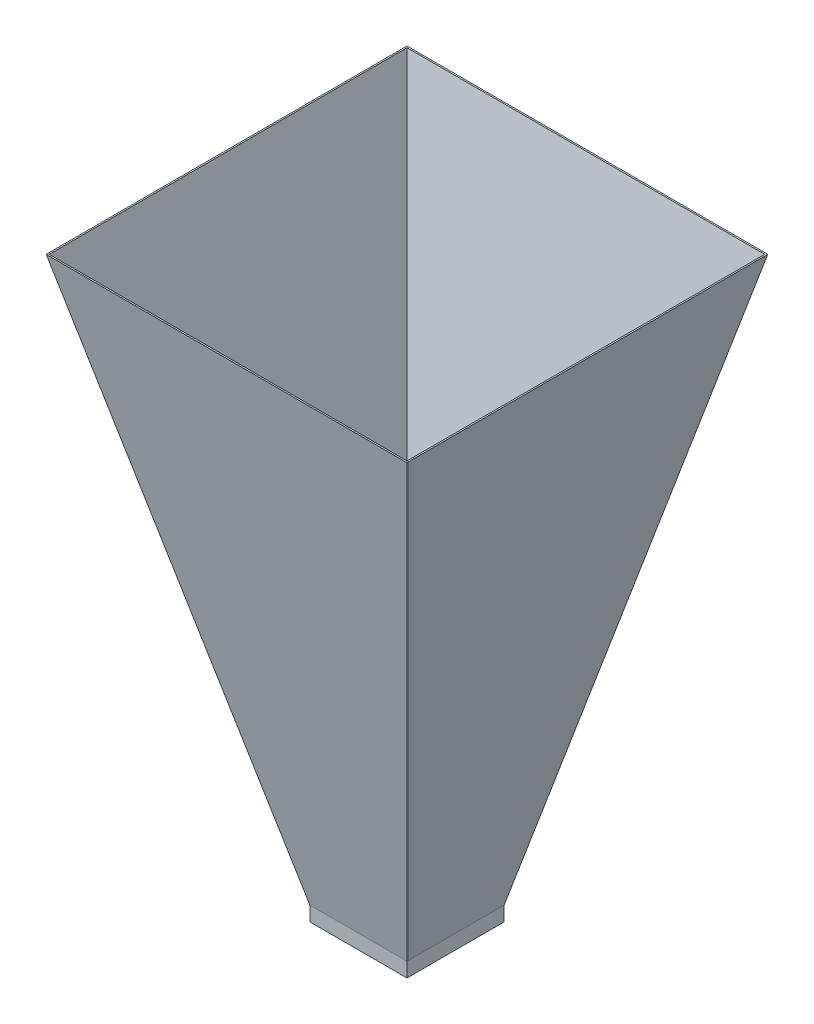
ISO-10303-21;
HEADER;
FILE_DESCRIPTION(('STEP AP214'),'2;1');
FILE_NAME('part.step','',(''),(''),'','','');
FILE_SCHEMA(('AUTOMOTIVE_DESIGN { 1 0 10303 214 1 1 1 1 }'));
ENDSEC;
DATA;
#1=APPLICATION_CONTEXT('core data for automotive mechanical design processes');
#2=APPLICATION_PROTOCOL_DEFINITION('international standard','automotive_design',2000,#1);
#3=PRODUCT_CONTEXT('',#1,'mechanical');
#4=PRODUCT('Part','Part','',(#3));
#5=PRODUCT_RELATED_PRODUCT_CATEGORY('part','',(#4));
#6=PRODUCT_DEFINITION_FORMATION('','',#4);
#7=PRODUCT_DEFINITION_CONTEXT('part definition',#1,'design');
#8=PRODUCT_DEFINITION('design','',#6,#7);
#9=PRODUCT_DEFINITION_SHAPE('','',#8);
#10=(LENGTH_UNIT() NAMED_UNIT(*) SI_UNIT(.MILLI.,.METRE.));
#11=(NAMED_UNIT(*) PLANE_ANGLE_UNIT() SI_UNIT($,.RADIAN.));
#12=(NAMED_UNIT(*) SI_UNIT($,.STERADIAN.) SOLID_ANGLE_UNIT());
#13=UNCERTAINTY_MEASURE_WITH_UNIT(LENGTH_MEASURE(1.E-05),#10,'distance_accuracy_value','');
#14=(GEOMETRIC_REPRESENTATION_CONTEXT(3) GLOBAL_UNCERTAINTY_ASSIGNED_CONTEXT((#13)) GLOBAL_UNIT_ASSIGNED_CONTEXT((#10,
#11,#12)) REPRESENTATION_CONTEXT('',''));
#15=CARTESIAN_POINT('',(0.,0.,0.));
#16=DIRECTION('',(0.,0.,1.));
#17=DIRECTION('',(1.,0.,0.));
#18=AXIS2_PLACEMENT_3D('',#15,#16,#17);
#19=CARTESIAN_POINT('',(0.,-6.16465834193122,26.3522208242994));
#20=DIRECTION('',(0.,0.227783482106071,-0.973711808123755));
#21=DIRECTION('',(0.,0.973711808123755,0.227783482106071));
#22=AXIS2_PLACEMENT_3D('',#19,#20,#21);
#23=PLANE('',#22);
#24=DIRECTION('',(0.,-0.973711808123755,-0.227783482106071));
#25=VECTOR('',#24,1.);
#26=CARTESIAN_POINT('',(32.5,-4.11365960757952,26.8320174433894));
#27=LINE('',#26,#25);
#28=CARTESIAN_POINT('',(32.5,20.1154086838659,32.5));
#29=VERTEX_POINT('',#28);
#30=CARTESIAN_POINT('',(32.5,20.,32.4730020816663));
#31=VERTEX_POINT('',#30);
#32=EDGE_CURVE('E133',#29,#31,#27,.T.);
#33=ORIENTED_EDGE('',*,*,#32,.F.);
#34=DIRECTION('',(1.,0.,0.));
#35=VECTOR('',#34,1.);
#36=CARTESIAN_POINT('',(33.5,20.1154086838659,32.5));
#37=LINE('',#36,#35);
#38=CARTESIAN_POINT('',(-32.5,20.1154086838659,32.5));
#39=VERTEX_POINT('',#38);
#40=EDGE_CURVE('E123',#39,#29,#37,.T.);
#41=ORIENTED_EDGE('',*,*,#40,.F.);
#42=DIRECTION('',(0.,0.973711808123755,0.227783482106071));
#43=VECTOR('',#42,1.);
#44=CARTESIAN_POINT('',(-32.5,10.7466366293097,30.308333529654));
#45=LINE('',#44,#43);
#46=CARTESIAN_POINT('',(-32.5,20.,32.4730020816663));
#47=VERTEX_POINT('',#46);
#48=EDGE_CURVE('E77',#47,#39,#45,.T.);
#49=ORIENTED_EDGE('',*,*,#48,.F.);
#50=DIRECTION('',(-1.,0.,0.));
#51=VECTOR('',#50,1.);
#52=CARTESIAN_POINT('',(0.,20.,32.4730020816663));
#53=LINE('',#52,#51);
#54=CARTESIAN_POINT('',(-33.5,20.,32.4730020816663));
#55=VERTEX_POINT('',#54);
#56=EDGE_CURVE('E145',#47,#55,#53,.T.);
#57=ORIENTED_EDGE('',*,*,#56,.T.);
#58=DIRECTION('',(-0.222094616583597,0.949393470890321,0.222094616583597));
#59=VECTOR('',#58,1.);
#60=CARTESIAN_POINT('',(-26.0287108865205,-11.9377084081706,25.0017129681868));
#61=LINE('',#60,#59);
#62=CARTESIAN_POINT('',(-124.5,409.,123.473002081666));
#63=VERTEX_POINT('',#62);
#64=EDGE_CURVE('E352',#55,#63,#61,.T.);
#65=ORIENTED_EDGE('',*,*,#64,.T.);
#66=DIRECTION('',(1.,0.,0.));
#67=VECTOR('',#66,1.);
#68=CARTESIAN_POINT('',(0.,409.,123.473002081666));
#69=LINE('',#68,#67);
#70=CARTESIAN_POINT('',(124.5,409.,123.473002081666));
#71=VERTEX_POINT('',#70);
#72=EDGE_CURVE('E129',#63,#71,#69,.T.);
#73=ORIENTED_EDGE('',*,*,#72,.T.);
#74=DIRECTION('',(-0.222094616583597,-0.949393470890321,-0.222094616583597));
#75=VECTOR('',#74,1.);
#76=CARTESIAN_POINT('',(26.0287108865205,-11.9377084081706,25.0017129681868));
#77=LINE('',#76,#75);
#78=CARTESIAN_POINT('',(33.5,20.,32.4730020816664));
#79=VERTEX_POINT('',#78);
#80=EDGE_CURVE('E349',#71,#79,#77,.T.);
#81=ORIENTED_EDGE('',*,*,#80,.T.);
#82=EDGE_CURVE('E141',#79,#31,#53,.T.);
#83=ORIENTED_EDGE('',*,*,#82,.T.);
#84=EDGE_LOOP('',(#33,#41,#49,#57,#65,#73,#81,#83));
#85=FACE_BOUND('',#84,.T.);
#86=ADVANCED_FACE('F59',(#85),#23,.T.);
#87=CARTESIAN_POINT('',(32.5,10.,-33.5));
#88=DIRECTION('',(-1.,0.,0.));
#89=DIRECTION('',(0.,0.,1.));
#90=AXIS2_PLACEMENT_3D('',#87,#88,#89);
#91=PLANE('',#90);
#92=DIRECTION('',(0.,1.,0.));
#93=VECTOR('',#92,1.);
#94=CARTESIAN_POINT('',(32.5,10.,32.5));
#95=LINE('',#94,#93);
#96=CARTESIAN_POINT('',(32.5,20.,32.5));
#97=VERTEX_POINT('',#96);
#98=EDGE_CURVE('E69',#97,#29,#95,.T.);
#99=ORIENTED_EDGE('',*,*,#98,.T.);
#100=ORIENTED_EDGE('',*,*,#32,.T.);
#101=DIRECTION('',(0.,0.,-1.));
#102=VECTOR('',#101,1.);
#103=CARTESIAN_POINT('',(32.5,20.,-33.5));
#104=LINE('',#103,#102);
#105=EDGE_CURVE('E136',#97,#31,#104,.T.);
#106=ORIENTED_EDGE('',*,*,#105,.F.);
#107=EDGE_LOOP('',(#99,#100,#106));
#108=FACE_BOUND('',#107,.T.);
#109=ADVANCED_FACE('F132',(#108),#91,.T.);
#110=CARTESIAN_POINT('',(33.5,10.,32.5));
#111=DIRECTION('',(0.,0.,-1.));
#112=DIRECTION('',(-1.,0.,0.));
#113=AXIS2_PLACEMENT_3D('',#110,#111,#112);
#114=PLANE('',#113);
#115=DIRECTION('',(1.,0.,0.));
#116=VECTOR('',#115,1.);
#117=CARTESIAN_POINT('',(33.5,20.,32.5));
#118=LINE('',#117,#116);
#119=CARTESIAN_POINT('',(-32.5,20.,32.5));
#120=VERTEX_POINT('',#119);
#121=EDGE_CURVE('E149',#120,#97,#118,.T.);
#122=ORIENTED_EDGE('',*,*,#121,.F.);
#123=DIRECTION('',(0.,1.,0.));
#124=VECTOR('',#123,1.);
#125=CARTESIAN_POINT('',(-32.5,10.,32.5));
#126=LINE('',#125,#124);
#127=EDGE_CURVE('E14',#120,#39,#126,.T.);
#128=ORIENTED_EDGE('',*,*,#127,.T.);
#129=ORIENTED_EDGE('',*,*,#40,.T.);
#130=ORIENTED_EDGE('',*,*,#98,.F.);
#131=EDGE_LOOP('',(#122,#128,#129,#130));
#132=FACE_BOUND('',#131,.T.);
#133=ADVANCED_FACE('F126',(#132),#114,.T.);
#134=CARTESIAN_POINT('',(0.,20.,0.));
#135=DIRECTION('',(0.,1.,0.));
#136=DIRECTION('',(0.,0.,1.));
#137=AXIS2_PLACEMENT_3D('',#134,#135,#136);
#138=PLANE('',#137);
#139=ORIENTED_EDGE('',*,*,#82,.F.);
#140=DIRECTION('',(0.,0.,-1.));
#141=VECTOR('',#140,1.);
#142=CARTESIAN_POINT('',(33.5,20.,33.5));
#143=LINE('',#142,#141);
#144=CARTESIAN_POINT('',(33.5,20.,33.5));
#145=VERTEX_POINT('',#144);
#146=EDGE_CURVE('E211',#145,#79,#143,.T.);
#147=ORIENTED_EDGE('',*,*,#146,.F.);
#148=DIRECTION('',(1.,0.,0.));
#149=VECTOR('',#148,1.);
#150=CARTESIAN_POINT('',(-33.5,20.,33.5));
#151=LINE('',#150,#149);
#152=CARTESIAN_POINT('',(-33.5,20.,33.5));
#153=VERTEX_POINT('',#152);
#154=EDGE_CURVE('E84',#153,#145,#151,.T.);
#155=ORIENTED_EDGE('',*,*,#154,.F.);
#156=DIRECTION('',(0.,0.,1.));
#157=VECTOR('',#156,1.);
#158=CARTESIAN_POINT('',(-33.5,20.,33.5));
#159=LINE('',#158,#157);
#160=EDGE_CURVE('E206',#55,#153,#159,.T.);
#161=ORIENTED_EDGE('',*,*,#160,.F.);
#162=ORIENTED_EDGE('',*,*,#56,.F.);
#163=DIRECTION('',(0.,0.,1.));
#164=VECTOR('',#163,1.);
#165=CARTESIAN_POINT('',(-32.5,20.,33.5));
#166=LINE('',#165,#164);
#167=EDGE_CURVE('E143',#47,#120,#166,.T.);
#168=ORIENTED_EDGE('',*,*,#167,.T.);
#169=ORIENTED_EDGE('',*,*,#121,.T.);
#170=ORIENTED_EDGE('',*,*,#105,.T.);
#171=EDGE_LOOP('',(#139,#147,#155,#161,#162,#168,#169,#170));
#172=FACE_BOUND('',#171,.T.);
#173=ADVANCED_FACE('F172',(#172),#138,.F.);
#174=CARTESIAN_POINT('',(-32.5,10.,33.5));
#175=DIRECTION('',(1.,0.,0.));
#176=DIRECTION('',(0.,0.,-1.));
#177=AXIS2_PLACEMENT_3D('',#174,#175,#176);
#178=PLANE('',#177);
#179=ORIENTED_EDGE('',*,*,#167,.F.);
#180=ORIENTED_EDGE('',*,*,#48,.T.);
#181=ORIENTED_EDGE('',*,*,#127,.F.);
#182=EDGE_LOOP('',(#179,#180,#181));
#183=FACE_BOUND('',#182,.T.);
#184=ADVANCED_FACE('F265',(#183),#178,.T.);
#185=CARTESIAN_POINT('',(0.,-6.39244182403729,27.3259326324231));
#186=DIRECTION('',(0.,0.227783482106071,-0.973711808123755));
#187=DIRECTION('',(0.,0.973711808123755,0.227783482106071));
#188=AXIS2_PLACEMENT_3D('',#185,#186,#187);
#189=PLANE('',#188);
#190=DIRECTION('',(0.222094616583597,0.949393470890321,0.222094616583597));
#191=VECTOR('',#190,1.);
#192=CARTESIAN_POINT('',(33.5,20.,33.5));
#193=LINE('',#192,#191);
#194=CARTESIAN_POINT('',(124.5,409.,124.5));
#195=VERTEX_POINT('',#194);
#196=EDGE_CURVE('E207',#145,#195,#193,.T.);
#197=ORIENTED_EDGE('',*,*,#196,.T.);
#198=DIRECTION('',(1.,0.,0.));
#199=VECTOR('',#198,1.);
#200=CARTESIAN_POINT('',(-124.5,409.,124.5));
#201=LINE('',#200,#199);
#202=CARTESIAN_POINT('',(-124.5,409.,124.5));
#203=VERTEX_POINT('',#202);
#204=EDGE_CURVE('E182',#203,#195,#201,.T.);
#205=ORIENTED_EDGE('',*,*,#204,.F.);
#206=DIRECTION('',(-0.222094616583597,0.949393470890321,0.222094616583597));
#207=VECTOR('',#206,1.);
#208=CARTESIAN_POINT('',(-33.5,20.,33.5));
#209=LINE('',#208,#207);
#210=EDGE_CURVE('E271',#153,#203,#209,.T.);
#211=ORIENTED_EDGE('',*,*,#210,.F.);
#212=ORIENTED_EDGE('',*,*,#154,.T.);
#213=EDGE_LOOP('',(#197,#205,#211,#212));
#214=FACE_BOUND('',#213,.T.);
#215=ADVANCED_FACE('F262',(#214),#189,.F.);
#216=CARTESIAN_POINT('',(-27.3259326324231,-6.39244182403729,0.));
#217=DIRECTION('',(0.973711808123755,0.227783482106071,0.));
#218=DIRECTION('',(-0.227783482106071,0.973711808123755,0.));
#219=AXIS2_PLACEMENT_3D('',#216,#217,#218);
#220=PLANE('',#219);
#221=ORIENTED_EDGE('',*,*,#64,.F.);
#222=ORIENTED_EDGE('',*,*,#160,.T.);
#223=ORIENTED_EDGE('',*,*,#210,.T.);
#224=DIRECTION('',(0.,0.,1.));
#225=VECTOR('',#224,1.);
#226=CARTESIAN_POINT('',(-124.5,409.,-124.5));
#227=LINE('',#226,#225);
#228=EDGE_CURVE('E245',#63,#203,#227,.T.);
#229=ORIENTED_EDGE('',*,*,#228,.F.);
#230=EDGE_LOOP('',(#221,#222,#223,#229));
#231=FACE_BOUND('',#230,.T.);
#232=ADVANCED_FACE('F253',(#231),#220,.F.);
#233=CARTESIAN_POINT('',(27.3259326324231,-6.39244182403729,0.));
#234=DIRECTION('',(-0.973711808123755,0.227783482106071,0.));
#235=DIRECTION('',(-0.227783482106071,-0.973711808123755,0.));
#236=AXIS2_PLACEMENT_3D('',#233,#234,#235);
#237=PLANE('',#236);
#238=ORIENTED_EDGE('',*,*,#80,.F.);
#239=DIRECTION('',(0.,0.,-1.));
#240=VECTOR('',#239,1.);
#241=CARTESIAN_POINT('',(124.5,409.,124.5));
#242=LINE('',#241,#240);
#243=EDGE_CURVE('E151',#195,#71,#242,.T.);
#244=ORIENTED_EDGE('',*,*,#243,.F.);
#245=ORIENTED_EDGE('',*,*,#196,.F.);
#246=ORIENTED_EDGE('',*,*,#146,.T.);
#247=EDGE_LOOP('',(#238,#244,#245,#246));
#248=FACE_BOUND('',#247,.T.);
#249=ADVANCED_FACE('F61',(#248),#237,.F.);
#250=CARTESIAN_POINT('',(0.,409.,0.));
#251=DIRECTION('',(0.,1.,0.));
#252=DIRECTION('',(0.,0.,1.));
#253=AXIS2_PLACEMENT_3D('',#250,#251,#252);
#254=PLANE('',#253);
#255=ORIENTED_EDGE('',*,*,#243,.T.);
#256=ORIENTED_EDGE('',*,*,#72,.F.);
#257=ORIENTED_EDGE('',*,*,#228,.T.);
#258=ORIENTED_EDGE('',*,*,#204,.T.);
#259=EDGE_LOOP('',(#255,#256,#257,#258));
#260=FACE_BOUND('',#259,.T.);
#261=ADVANCED_FACE('F160',(#260),#254,.T.);
#262=CLOSED_SHELL('',(#86,#109,#133,#173,#184,#215,#232,#249,#261));
#263=MANIFOLD_SOLID_BREP('B2',#262);
#264=CARTESIAN_POINT('',(0.,-6.16465834193122,26.3522208242994));
#265=DIRECTION('',(0.,0.227783482106071,-0.973711808123755));
#266=DIRECTION('',(0.,0.973711808123755,0.227783482106071));
#267=AXIS2_PLACEMENT_3D('',#264,#265,#266);
#268=PLANE('',#267);
#269=DIRECTION('',(0.,-0.973711808123755,-0.227783482106071));
#270=VECTOR('',#269,1.);
#271=CARTESIAN_POINT('',(32.5,-4.11365960757952,26.8320174433894));
#272=LINE('',#271,#270);
#273=CARTESIAN_POINT('',(32.5,20.1154086838659,32.5));
#274=VERTEX_POINT('',#273);
#275=CARTESIAN_POINT('',(32.5,20.,32.4730020816663));
#276=VERTEX_POINT('',#275);
#277=EDGE_CURVE('E505',#274,#276,#272,.T.);
#278=ORIENTED_EDGE('',*,*,#277,.T.);
#279=DIRECTION('',(-1.,0.,0.));
#280=VECTOR('',#279,1.);
#281=CARTESIAN_POINT('',(0.,20.,32.4730020816663));
#282=LINE('',#281,#280);
#283=CARTESIAN_POINT('',(33.5,20.,32.4730020816664));
#284=VERTEX_POINT('',#283);
#285=EDGE_CURVE('E746',#284,#276,#282,.T.);
#286=ORIENTED_EDGE('',*,*,#285,.F.);
#287=DIRECTION('',(-0.222094616583597,-0.949393470890321,-0.222094616583597));
#288=VECTOR('',#287,1.);
#289=CARTESIAN_POINT('',(26.0287108865205,-11.9377084081706,25.0017129681868));
#290=LINE('',#289,#288);
#291=CARTESIAN_POINT('',(124.5,409.,123.473002081666));
#292=VERTEX_POINT('',#291);
#293=EDGE_CURVE('E601',#292,#284,#290,.T.);
#294=ORIENTED_EDGE('',*,*,#293,.F.);
#295=DIRECTION('',(-1.,0.,0.));
#296=VECTOR('',#295,1.);
#297=CARTESIAN_POINT('',(0.,409.,123.473002081666));
#298=LINE('',#297,#296);
#299=CARTESIAN_POINT('',(123.473002081666,409.,123.473002081666));
#300=VERTEX_POINT('',#299);
#301=EDGE_CURVE('E508',#292,#300,#298,.T.);
#302=ORIENTED_EDGE('',*,*,#301,.T.);
#303=DIRECTION('',(0.222094616583597,0.949393470890321,0.222094616583597));
#304=VECTOR('',#303,1.);
#305=CARTESIAN_POINT('',(25.0523706867273,-11.721160578366,25.0523706867273));
#306=LINE('',#305,#304);
#307=EDGE_CURVE('E502',#274,#300,#306,.T.);
#308=ORIENTED_EDGE('',*,*,#307,.F.);
#309=EDGE_LOOP('',(#278,#286,#294,#302,#308));
#310=FACE_BOUND('',#309,.T.);
#311=ADVANCED_FACE('F422',(#310),#268,.F.);
#312=DIRECTION('',(-0.222094616583597,0.949393470890321,0.222094616583597));
#313=VECTOR('',#312,1.);
#314=CARTESIAN_POINT('',(-25.0523706867272,-11.721160578366,25.0523706867273));
#315=LINE('',#314,#313);
#316=CARTESIAN_POINT('',(-32.5,20.1154086838659,32.5));
#317=VERTEX_POINT('',#316);
#318=CARTESIAN_POINT('',(-123.473002081666,409.,123.473002081666));
#319=VERTEX_POINT('',#318);
#320=EDGE_CURVE('E57',#317,#319,#315,.T.);
#321=ORIENTED_EDGE('',*,*,#320,.T.);
#322=CARTESIAN_POINT('',(-124.5,409.,123.473002081666));
#323=VERTEX_POINT('',#322);
#324=EDGE_CURVE('E446',#319,#323,#298,.T.);
#325=ORIENTED_EDGE('',*,*,#324,.T.);
#326=DIRECTION('',(-0.222094616583597,0.949393470890321,0.222094616583597));
#327=VECTOR('',#326,1.);
#328=CARTESIAN_POINT('',(-26.0287108865205,-11.9377084081706,25.0017129681868));
#329=LINE('',#328,#327);
#330=CARTESIAN_POINT('',(-33.5,20.,32.4730020816663));
#331=VERTEX_POINT('',#330);
#332=EDGE_CURVE('E685',#331,#323,#329,.T.);
#333=ORIENTED_EDGE('',*,*,#332,.F.);
#334=CARTESIAN_POINT('',(-32.5,20.,32.4730020816663));
#335=VERTEX_POINT('',#334);
#336=EDGE_CURVE('E681',#335,#331,#282,.T.);
#337=ORIENTED_EDGE('',*,*,#336,.F.);
#338=DIRECTION('',(0.,0.973711808123755,0.227783482106071));
#339=VECTOR('',#338,1.);
#340=CARTESIAN_POINT('',(-32.5,10.7466366293097,30.308333529654));
#341=LINE('',#340,#339);
#342=EDGE_CURVE('E432',#335,#317,#341,.T.);
#343=ORIENTED_EDGE('',*,*,#342,.T.);
#344=EDGE_LOOP('',(#321,#325,#333,#337,#343));
#345=FACE_BOUND('',#344,.T.);
#346=ADVANCED_FACE('F424',(#345),#268,.F.);
#347=CARTESIAN_POINT('',(0.,-6.39244182403729,-27.3259326324232));
#348=DIRECTION('',(0.,0.227783482106071,0.973711808123755));
#349=DIRECTION('',(0.,-0.973711808123755,0.227783482106071));
#350=AXIS2_PLACEMENT_3D('',#347,#348,#349);
#351=PLANE('',#350);
#352=DIRECTION('',(-0.222094616583597,0.949393470890321,-0.222094616583597));
#353=VECTOR('',#352,1.);
#354=CARTESIAN_POINT('',(-33.5,20.,-33.5));
#355=LINE('',#354,#353);
#356=CARTESIAN_POINT('',(-33.5,20.,-33.5));
#357=VERTEX_POINT('',#356);
#358=CARTESIAN_POINT('',(-124.5,409.,-124.5));
#359=VERTEX_POINT('',#358);
#360=EDGE_CURVE('E661',#357,#359,#355,.T.);
#361=ORIENTED_EDGE('',*,*,#360,.T.);
#362=DIRECTION('',(-1.,0.,0.));
#363=VECTOR('',#362,1.);
#364=CARTESIAN_POINT('',(124.5,409.,-124.5));
#365=LINE('',#364,#363);
#366=CARTESIAN_POINT('',(124.5,409.,-124.5));
#367=VERTEX_POINT('',#366);
#368=EDGE_CURVE('E664',#367,#359,#365,.T.);
#369=ORIENTED_EDGE('',*,*,#368,.F.);
#370=DIRECTION('',(0.222094616583597,0.949393470890321,-0.222094616583597));
#371=VECTOR('',#370,1.);
#372=CARTESIAN_POINT('',(33.5,20.,-33.5));
#373=LINE('',#372,#371);
#374=CARTESIAN_POINT('',(33.5,20.,-33.5));
#375=VERTEX_POINT('',#374);
#376=EDGE_CURVE('E552',#375,#367,#373,.T.);
#377=ORIENTED_EDGE('',*,*,#376,.F.);
#378=DIRECTION('',(-1.,0.,0.));
#379=VECTOR('',#378,1.);
#380=CARTESIAN_POINT('',(-33.5,20.,-33.5));
#381=LINE('',#380,#379);
#382=EDGE_CURVE('E629',#375,#357,#381,.T.);
#383=ORIENTED_EDGE('',*,*,#382,.T.);
#384=EDGE_LOOP('',(#361,#369,#377,#383));
#385=FACE_BOUND('',#384,.T.);
#386=ADVANCED_FACE('F569',(#385),#351,.F.);
#387=CARTESIAN_POINT('',(0.,409.,0.));
#388=DIRECTION('',(0.,1.,0.));
#389=DIRECTION('',(0.,0.,1.));
#390=AXIS2_PLACEMENT_3D('',#387,#388,#389);
#391=PLANE('',#390);
#392=ORIENTED_EDGE('',*,*,#301,.F.);
#393=DIRECTION('',(0.,0.,-1.));
#394=VECTOR('',#393,1.);
#395=CARTESIAN_POINT('',(124.5,409.,124.5));
#396=LINE('',#395,#394);
#397=EDGE_CURVE('E592',#292,#367,#396,.T.);
#398=ORIENTED_EDGE('',*,*,#397,.T.);
#399=ORIENTED_EDGE('',*,*,#368,.T.);
#400=DIRECTION('',(0.,0.,1.));
#401=VECTOR('',#400,1.);
#402=CARTESIAN_POINT('',(-124.5,409.,-124.5));
#403=LINE('',#402,#401);
#404=EDGE_CURVE('E426',#359,#323,#403,.T.);
#405=ORIENTED_EDGE('',*,*,#404,.T.);
#406=ORIENTED_EDGE('',*,*,#324,.F.);
#407=DIRECTION('',(0.,0.,1.));
#408=VECTOR('',#407,1.);
#409=CARTESIAN_POINT('',(-123.473002081666,409.,0.));
#410=LINE('',#409,#408);
#411=CARTESIAN_POINT('',(-123.473002081666,409.,-123.473002081666));
#412=VERTEX_POINT('',#411);
#413=EDGE_CURVE('E543',#412,#319,#410,.T.);
#414=ORIENTED_EDGE('',*,*,#413,.F.);
#415=DIRECTION('',(-1.,0.,0.));
#416=VECTOR('',#415,1.);
#417=CARTESIAN_POINT('',(0.,409.,-123.473002081666));
#418=LINE('',#417,#416);
#419=CARTESIAN_POINT('',(123.473002081666,409.,-123.473002081666));
#420=VERTEX_POINT('',#419);
#421=EDGE_CURVE('E536',#420,#412,#418,.T.);
#422=ORIENTED_EDGE('',*,*,#421,.F.);
#423=DIRECTION('',(0.,0.,-1.));
#424=VECTOR('',#423,1.);
#425=CARTESIAN_POINT('',(123.473002081666,409.,0.));
#426=LINE('',#425,#424);
#427=EDGE_CURVE('E540',#300,#420,#426,.T.);
#428=ORIENTED_EDGE('',*,*,#427,.F.);
#429=EDGE_LOOP('',(#392,#398,#399,#405,#406,#414,#422,#428));
#430=FACE_BOUND('',#429,.T.);
#431=ADVANCED_FACE('F622',(#430),#391,.T.);
#432=CARTESIAN_POINT('',(0.,-6.16465834193122,-26.3522208242994));
#433=DIRECTION('',(0.,0.227783482106071,0.973711808123755));
#434=DIRECTION('',(0.,-0.973711808123755,0.227783482106071));
#435=AXIS2_PLACEMENT_3D('',#432,#433,#434);
#436=PLANE('',#435);
#437=DIRECTION('',(-0.222094616583597,0.949393470890321,-0.222094616583597));
#438=VECTOR('',#437,1.);
#439=CARTESIAN_POINT('',(-25.0523706867272,-11.721160578366,-25.0523706867273));
#440=LINE('',#439,#438);
#441=CARTESIAN_POINT('',(-32.5,20.1154086838659,-32.5));
#442=VERTEX_POINT('',#441);
#443=EDGE_CURVE('E512',#442,#412,#440,.T.);
#444=ORIENTED_EDGE('',*,*,#443,.F.);
#445=DIRECTION('',(-1.,0.,0.));
#446=VECTOR('',#445,1.);
#447=CARTESIAN_POINT('',(-33.5,20.1154086838659,-32.5));
#448=LINE('',#447,#446);
#449=CARTESIAN_POINT('',(32.5,20.1154086838659,-32.5));
#450=VERTEX_POINT('',#449);
#451=EDGE_CURVE('E525',#450,#442,#448,.T.);
#452=ORIENTED_EDGE('',*,*,#451,.F.);
#453=DIRECTION('',(0.222094616583597,0.949393470890321,-0.222094616583597));
#454=VECTOR('',#453,1.);
#455=CARTESIAN_POINT('',(25.0523706867272,-11.721160578366,-25.0523706867273));
#456=LINE('',#455,#454);
#457=EDGE_CURVE('E513',#450,#420,#456,.T.);
#458=ORIENTED_EDGE('',*,*,#457,.T.);
#459=ORIENTED_EDGE('',*,*,#421,.T.);
#460=EDGE_LOOP('',(#444,#452,#458,#459));
#461=FACE_BOUND('',#460,.T.);
#462=ADVANCED_FACE('F717',(#461),#436,.T.);
#463=CARTESIAN_POINT('',(-26.3522208242994,-6.16465834193122,0.));
#464=DIRECTION('',(0.973711808123755,0.227783482106071,0.));
#465=DIRECTION('',(-0.227783482106071,0.973711808123755,0.));
#466=AXIS2_PLACEMENT_3D('',#463,#464,#465);
#467=PLANE('',#466);
#468=ORIENTED_EDGE('',*,*,#320,.F.);
#469=DIRECTION('',(0.,0.,1.));
#470=VECTOR('',#469,1.);
#471=CARTESIAN_POINT('',(-32.5,20.1154086838659,33.5));
#472=LINE('',#471,#470);
#473=EDGE_CURVE('E529',#442,#317,#472,.T.);
#474=ORIENTED_EDGE('',*,*,#473,.F.);
#475=ORIENTED_EDGE('',*,*,#443,.T.);
#476=ORIENTED_EDGE('',*,*,#413,.T.);
#477=EDGE_LOOP('',(#468,#474,#475,#476));
#478=FACE_BOUND('',#477,.T.);
#479=ADVANCED_FACE('F713',(#478),#467,.T.);
#480=CARTESIAN_POINT('',(-33.5,10.,-32.5));
#481=DIRECTION('',(0.,0.,1.));
#482=DIRECTION('',(1.,0.,0.));
#483=AXIS2_PLACEMENT_3D('',#480,#481,#482);
#484=PLANE('',#483);
#485=DIRECTION('',(-1.,0.,0.));
#486=VECTOR('',#485,1.);
#487=CARTESIAN_POINT('',(-33.5,20.,-32.5));
#488=LINE('',#487,#486);
#489=CARTESIAN_POINT('',(32.5,20.,-32.5));
#490=VERTEX_POINT('',#489);
#491=CARTESIAN_POINT('',(-32.5,20.,-32.5));
#492=VERTEX_POINT('',#491);
#493=EDGE_CURVE('E650',#490,#492,#488,.T.);
#494=ORIENTED_EDGE('',*,*,#493,.F.);
#495=DIRECTION('',(0.,1.,0.));
#496=VECTOR('',#495,1.);
#497=CARTESIAN_POINT('',(32.5,10.,-32.5));
#498=LINE('',#497,#496);
#499=EDGE_CURVE('E526',#490,#450,#498,.T.);
#500=ORIENTED_EDGE('',*,*,#499,.T.);
#501=ORIENTED_EDGE('',*,*,#451,.T.);
#502=DIRECTION('',(0.,1.,0.));
#503=VECTOR('',#502,1.);
#504=CARTESIAN_POINT('',(-32.5,10.,-32.5));
#505=LINE('',#504,#503);
#506=EDGE_CURVE('E531',#492,#442,#505,.T.);
#507=ORIENTED_EDGE('',*,*,#506,.F.);
#508=EDGE_LOOP('',(#494,#500,#501,#507));
#509=FACE_BOUND('',#508,.T.);
#510=ADVANCED_FACE('F621',(#509),#484,.T.);
#511=CARTESIAN_POINT('',(0.,20.,0.));
#512=DIRECTION('',(0.,1.,0.));
#513=DIRECTION('',(0.,0.,1.));
#514=AXIS2_PLACEMENT_3D('',#511,#512,#513);
#515=PLANE('',#514);
#516=DIRECTION('',(0.,0.,-1.));
#517=VECTOR('',#516,1.);
#518=CARTESIAN_POINT('',(33.5,20.,33.5));
#519=LINE('',#518,#517);
#520=EDGE_CURVE('E542',#284,#375,#519,.T.);
#521=ORIENTED_EDGE('',*,*,#520,.F.);
#522=ORIENTED_EDGE('',*,*,#285,.T.);
#523=DIRECTION('',(0.,0.,-1.));
#524=VECTOR('',#523,1.);
#525=CARTESIAN_POINT('',(32.5,20.,-33.5));
#526=LINE('',#525,#524);
#527=EDGE_CURVE('E521',#276,#490,#526,.T.);
#528=ORIENTED_EDGE('',*,*,#527,.T.);
#529=ORIENTED_EDGE('',*,*,#493,.T.);
#530=DIRECTION('',(0.,0.,1.));
#531=VECTOR('',#530,1.);
#532=CARTESIAN_POINT('',(-32.5,20.,33.5));
#533=LINE('',#532,#531);
#534=EDGE_CURVE('E723',#492,#335,#533,.T.);
#535=ORIENTED_EDGE('',*,*,#534,.T.);
#536=ORIENTED_EDGE('',*,*,#336,.T.);
#537=DIRECTION('',(0.,0.,1.));
#538=VECTOR('',#537,1.);
#539=CARTESIAN_POINT('',(-33.5,20.,33.5));
#540=LINE('',#539,#538);
#541=EDGE_CURVE('E637',#357,#331,#540,.T.);
#542=ORIENTED_EDGE('',*,*,#541,.F.);
#543=ORIENTED_EDGE('',*,*,#382,.F.);
#544=EDGE_LOOP('',(#521,#522,#528,#529,#535,#536,#542,#543));
#545=FACE_BOUND('',#544,.T.);
#546=ADVANCED_FACE('F612',(#545),#515,.F.);
#547=CARTESIAN_POINT('',(-32.5,10.,33.5));
#548=DIRECTION('',(1.,0.,0.));
#549=DIRECTION('',(0.,0.,-1.));
#550=AXIS2_PLACEMENT_3D('',#547,#548,#549);
#551=PLANE('',#550);
#552=ORIENTED_EDGE('',*,*,#342,.F.);
#553=ORIENTED_EDGE('',*,*,#534,.F.);
#554=ORIENTED_EDGE('',*,*,#506,.T.);
#555=ORIENTED_EDGE('',*,*,#473,.T.);
#556=EDGE_LOOP('',(#552,#553,#554,#555));
#557=FACE_BOUND('',#556,.T.);
#558=ADVANCED_FACE('F567',(#557),#551,.T.);
#559=CARTESIAN_POINT('',(26.3522208242994,-6.16465834193122,0.));
#560=DIRECTION('',(-0.973711808123755,0.227783482106071,0.));
#561=DIRECTION('',(-0.227783482106071,-0.973711808123755,0.));
#562=AXIS2_PLACEMENT_3D('',#559,#560,#561);
#563=PLANE('',#562);
#564=ORIENTED_EDGE('',*,*,#457,.F.);
#565=DIRECTION('',(0.,0.,-1.));
#566=VECTOR('',#565,1.);
#567=CARTESIAN_POINT('',(32.5,20.1154086838659,-33.5));
#568=LINE('',#567,#566);
#569=EDGE_CURVE('E519',#274,#450,#568,.T.);
#570=ORIENTED_EDGE('',*,*,#569,.F.);
#571=ORIENTED_EDGE('',*,*,#307,.T.);
#572=ORIENTED_EDGE('',*,*,#427,.T.);
#573=EDGE_LOOP('',(#564,#570,#571,#572));
#574=FACE_BOUND('',#573,.T.);
#575=ADVANCED_FACE('F523',(#574),#563,.T.);
#576=CARTESIAN_POINT('',(32.5,10.,-33.5));
#577=DIRECTION('',(-1.,0.,0.));
#578=DIRECTION('',(0.,0.,1.));
#579=AXIS2_PLACEMENT_3D('',#576,#577,#578);
#580=PLANE('',#579);
#581=ORIENTED_EDGE('',*,*,#277,.F.);
#582=ORIENTED_EDGE('',*,*,#569,.T.);
#583=ORIENTED_EDGE('',*,*,#499,.F.);
#584=ORIENTED_EDGE('',*,*,#527,.F.);
#585=EDGE_LOOP('',(#581,#582,#583,#584));
#586=FACE_BOUND('',#585,.T.);
#587=ADVANCED_FACE('F517',(#586),#580,.T.);
#588=CARTESIAN_POINT('',(-27.3259326324231,-6.39244182403729,0.));
#589=DIRECTION('',(0.973711808123755,0.227783482106071,0.));
#590=DIRECTION('',(-0.227783482106071,0.973711808123755,0.));
#591=AXIS2_PLACEMENT_3D('',#588,#589,#590);
#592=PLANE('',#591);
#593=ORIENTED_EDGE('',*,*,#541,.T.);
#594=ORIENTED_EDGE('',*,*,#332,.T.);
#595=ORIENTED_EDGE('',*,*,#404,.F.);
#596=ORIENTED_EDGE('',*,*,#360,.F.);
#597=EDGE_LOOP('',(#593,#594,#595,#596));
#598=FACE_BOUND('',#597,.T.);
#599=ADVANCED_FACE('F565',(#598),#592,.F.);
#600=CARTESIAN_POINT('',(27.3259326324231,-6.39244182403729,0.));
#601=DIRECTION('',(-0.973711808123755,0.227783482106071,0.));
#602=DIRECTION('',(-0.227783482106071,-0.973711808123755,0.));
#603=AXIS2_PLACEMENT_3D('',#600,#601,#602);
#604=PLANE('',#603);
#605=ORIENTED_EDGE('',*,*,#397,.F.);
#606=ORIENTED_EDGE('',*,*,#293,.T.);
#607=ORIENTED_EDGE('',*,*,#520,.T.);
#608=ORIENTED_EDGE('',*,*,#376,.T.);
#609=EDGE_LOOP('',(#605,#606,#607,#608));
#610=FACE_BOUND('',#609,.T.);
#611=ADVANCED_FACE('F555',(#610),#604,.F.);
#612=CLOSED_SHELL('',(#311,#346,#386,#431,#462,#479,#510,#546,#558,#575,#587,#599,#611));
#613=MANIFOLD_SOLID_BREP('B8_NOT_SHOWN',#612);
#614=CARTESIAN_POINT('',(0.,20.,0.));
#615=DIRECTION('',(0.,1.,0.));
#616=DIRECTION('',(0.,0.,1.));
#617=AXIS2_PLACEMENT_3D('',#614,#615,#616);
#618=PLANE('',#617);
#619=CARTESIAN_POINT('',(33.5,20.,33.5));
#620=DIRECTION('',(0.,0.,-1.));
#621=VECTOR('',#620,1.);
#622=LINE('',#619,#621);
#623=CARTESIAN_POINT('',(33.5,20.,33.5));
#624=VERTEX_POINT('',#623);
#625=CARTESIAN_POINT('',(33.5,20.,-33.5));
#626=VERTEX_POINT('',#625);
#627=EDGE_CURVE('E1042',#624,#626,#622,.T.);
#628=ORIENTED_EDGE('',*,*,#627,.T.);
#629=CARTESIAN_POINT('',(33.5,20.,-33.5));
#630=DIRECTION('',(-1.,0.,0.));
#631=VECTOR('',#630,1.);
#632=LINE('',#629,#631);
#633=CARTESIAN_POINT('',(-33.5,20.,-33.5));
#634=VERTEX_POINT('',#633);
#635=EDGE_CURVE('E1052',#626,#634,#632,.T.);
#636=ORIENTED_EDGE('',*,*,#635,.T.);
#637=CARTESIAN_POINT('',(-33.5,20.,-33.5));
#638=DIRECTION('',(0.,0.,1.));
#639=VECTOR('',#638,1.);
#640=LINE('',#637,#639);
#641=CARTESIAN_POINT('',(-33.5,20.,33.5));
#642=VERTEX_POINT('',#641);
#643=EDGE_CURVE('E1061',#634,#642,#640,.T.);
#644=ORIENTED_EDGE('',*,*,#643,.T.);
#645=CARTESIAN_POINT('',(-33.5,20.,33.5));
#646=DIRECTION('',(1.,0.,0.));
#647=VECTOR('',#646,1.);
#648=LINE('',#645,#647);
#649=EDGE_CURVE('E1068',#642,#624,#648,.T.);
#650=ORIENTED_EDGE('',*,*,#649,.T.);
#651=EDGE_LOOP('',(#628,#636,#644,#650));
#652=FACE_BOUND('',#651,.T.);
#653=DIRECTION('',(-1.,0.,0.));
#654=VECTOR('',#653,1.);
#655=CARTESIAN_POINT('',(-33.5,20.,-32.5));
#656=LINE('',#655,#654);
#657=CARTESIAN_POINT('',(32.5,20.,-32.5));
#658=VERTEX_POINT('',#657);
#659=CARTESIAN_POINT('',(-32.5,20.,-32.5));
#660=VERTEX_POINT('',#659);
#661=EDGE_CURVE('E1109',#658,#660,#656,.T.);
#662=ORIENTED_EDGE('',*,*,#661,.F.);
#663=DIRECTION('',(0.,0.,-1.));
#664=VECTOR('',#663,1.);
#665=CARTESIAN_POINT('',(32.5,20.,-33.5));
#666=LINE('',#665,#664);
#667=CARTESIAN_POINT('',(32.5,20.,32.5));
#668=VERTEX_POINT('',#667);
#669=EDGE_CURVE('E1111',#668,#658,#666,.T.);
#670=ORIENTED_EDGE('',*,*,#669,.F.);
#671=DIRECTION('',(1.,0.,0.));
#672=VECTOR('',#671,1.);
#673=CARTESIAN_POINT('',(33.5,20.,32.5));
#674=LINE('',#673,#672);
#675=CARTESIAN_POINT('',(-32.5,20.,32.5));
#676=VERTEX_POINT('',#675);
#677=EDGE_CURVE('E1115',#676,#668,#674,.T.);
#678=ORIENTED_EDGE('',*,*,#677,.F.);
#679=DIRECTION('',(0.,0.,1.));
#680=VECTOR('',#679,1.);
#681=CARTESIAN_POINT('',(-32.5,20.,33.5));
#682=LINE('',#681,#680);
#683=EDGE_CURVE('E1049',#660,#676,#682,.T.);
#684=ORIENTED_EDGE('',*,*,#683,.F.);
#685=EDGE_LOOP('',(#662,#670,#678,#684));
#686=FACE_BOUND('',#685,.T.);
#687=ADVANCED_FACE('F968',(#652,#686),#618,.T.);
#688=CARTESIAN_POINT('',(33.5,10.,-33.5));
#689=DIRECTION('',(-1.,0.,0.));
#690=DIRECTION('',(0.,0.,1.));
#691=AXIS2_PLACEMENT_3D('',#688,#689,#690);
#692=PLANE('',#691);
#693=ORIENTED_EDGE('',*,*,#627,.F.);
#694=DIRECTION('',(0.,1.,0.));
#695=VECTOR('',#694,1.);
#696=CARTESIAN_POINT('',(33.5,10.,33.5));
#697=LINE('',#696,#695);
#698=CARTESIAN_POINT('',(33.5,10.,33.5));
#699=VERTEX_POINT('',#698);
#700=EDGE_CURVE('E1048',#699,#624,#697,.T.);
#701=ORIENTED_EDGE('',*,*,#700,.F.);
#702=DIRECTION('',(0.,0.,1.));
#703=VECTOR('',#702,1.);
#704=CARTESIAN_POINT('',(33.5,10.,-33.5));
#705=LINE('',#704,#703);
#706=CARTESIAN_POINT('',(33.5,10.,-33.5));
#707=VERTEX_POINT('',#706);
#708=EDGE_CURVE('E1044',#707,#699,#705,.T.);
#709=ORIENTED_EDGE('',*,*,#708,.F.);
#710=DIRECTION('',(0.,1.,0.));
#711=VECTOR('',#710,1.);
#712=CARTESIAN_POINT('',(33.5,10.,-33.5));
#713=LINE('',#712,#711);
#714=EDGE_CURVE('E1037',#707,#626,#713,.T.);
#715=ORIENTED_EDGE('',*,*,#714,.T.);
#716=EDGE_LOOP('',(#693,#701,#709,#715));
#717=FACE_BOUND('',#716,.T.);
#718=ADVANCED_FACE('F1039',(#717),#692,.F.);
#719=CARTESIAN_POINT('',(33.5,10.,33.5));
#720=DIRECTION('',(0.,0.,-1.));
#721=DIRECTION('',(-1.,0.,0.));
#722=AXIS2_PLACEMENT_3D('',#719,#720,#721);
#723=PLANE('',#722);
#724=ORIENTED_EDGE('',*,*,#649,.F.);
#725=DIRECTION('',(0.,1.,0.));
#726=VECTOR('',#725,1.);
#727=CARTESIAN_POINT('',(-33.5,10.,33.5));
#728=LINE('',#727,#726);
#729=CARTESIAN_POINT('',(-33.5,10.,33.5));
#730=VERTEX_POINT('',#729);
#731=EDGE_CURVE('E1178',#730,#642,#728,.T.);
#732=ORIENTED_EDGE('',*,*,#731,.F.);
#733=DIRECTION('',(-1.,0.,0.));
#734=VECTOR('',#733,1.);
#735=CARTESIAN_POINT('',(33.5,10.,33.5));
#736=LINE('',#735,#734);
#737=EDGE_CURVE('E1196',#699,#730,#736,.T.);
#738=ORIENTED_EDGE('',*,*,#737,.F.);
#739=ORIENTED_EDGE('',*,*,#700,.T.);
#740=EDGE_LOOP('',(#724,#732,#738,#739));
#741=FACE_BOUND('',#740,.T.);
#742=ADVANCED_FACE('F1143',(#741),#723,.F.);
#743=CARTESIAN_POINT('',(32.5,10.,-33.5));
#744=DIRECTION('',(-1.,0.,0.));
#745=DIRECTION('',(0.,0.,1.));
#746=AXIS2_PLACEMENT_3D('',#743,#744,#745);
#747=PLANE('',#746);
#748=DIRECTION('',(0.,1.,0.));
#749=VECTOR('',#748,1.);
#750=CARTESIAN_POINT('',(32.5,10.,32.5));
#751=LINE('',#750,#749);
#752=CARTESIAN_POINT('',(32.5,10.,32.5));
#753=VERTEX_POINT('',#752);
#754=EDGE_CURVE('E1121',#753,#668,#751,.T.);
#755=ORIENTED_EDGE('',*,*,#754,.T.);
#756=ORIENTED_EDGE('',*,*,#669,.T.);
#757=DIRECTION('',(0.,1.,0.));
#758=VECTOR('',#757,1.);
#759=CARTESIAN_POINT('',(32.5,10.,-32.5));
#760=LINE('',#759,#758);
#761=CARTESIAN_POINT('',(32.5,10.,-32.5));
#762=VERTEX_POINT('',#761);
#763=EDGE_CURVE('E1119',#762,#658,#760,.T.);
#764=ORIENTED_EDGE('',*,*,#763,.F.);
#765=DIRECTION('',(0.,0.,1.));
#766=VECTOR('',#765,1.);
#767=CARTESIAN_POINT('',(32.5,10.,-33.5));
#768=LINE('',#767,#766);
#769=EDGE_CURVE('E979',#762,#753,#768,.T.);
#770=ORIENTED_EDGE('',*,*,#769,.T.);
#771=EDGE_LOOP('',(#755,#756,#764,#770));
#772=FACE_BOUND('',#771,.T.);
#773=ADVANCED_FACE('F1141',(#772),#747,.T.);
#774=CARTESIAN_POINT('',(0.,10.,0.));
#775=DIRECTION('',(0.,-1.,0.));
#776=DIRECTION('',(0.,0.,-1.));
#777=AXIS2_PLACEMENT_3D('',#774,#775,#776);
#778=PLANE('',#777);
#779=DIRECTION('',(1.,0.,0.));
#780=VECTOR('',#779,1.);
#781=CARTESIAN_POINT('',(-33.5,10.,-32.5));
#782=LINE('',#781,#780);
#783=CARTESIAN_POINT('',(-32.5,10.,-32.5));
#784=VERTEX_POINT('',#783);
#785=EDGE_CURVE('E922',#784,#762,#782,.T.);
#786=ORIENTED_EDGE('',*,*,#785,.F.);
#787=DIRECTION('',(0.,0.,-1.));
#788=VECTOR('',#787,1.);
#789=CARTESIAN_POINT('',(-32.5,10.,33.5));
#790=LINE('',#789,#788);
#791=CARTESIAN_POINT('',(-32.5,10.,32.5));
#792=VERTEX_POINT('',#791);
#793=EDGE_CURVE('E1127',#792,#784,#790,.T.);
#794=ORIENTED_EDGE('',*,*,#793,.F.);
#795=DIRECTION('',(-1.,0.,0.));
#796=VECTOR('',#795,1.);
#797=CARTESIAN_POINT('',(33.5,10.,32.5));
#798=LINE('',#797,#796);
#799=EDGE_CURVE('E1129',#753,#792,#798,.T.);
#800=ORIENTED_EDGE('',*,*,#799,.F.);
#801=ORIENTED_EDGE('',*,*,#769,.F.);
#802=EDGE_LOOP('',(#786,#794,#800,#801));
#803=FACE_BOUND('',#802,.T.);
#804=DIRECTION('',(1.,0.,0.));
#805=VECTOR('',#804,1.);
#806=CARTESIAN_POINT('',(-33.5,10.,-33.5));
#807=LINE('',#806,#805);
#808=CARTESIAN_POINT('',(-33.5,10.,-33.5));
#809=VERTEX_POINT('',#808);
#810=EDGE_CURVE('E1122',#809,#707,#807,.T.);
#811=ORIENTED_EDGE('',*,*,#810,.T.);
#812=ORIENTED_EDGE('',*,*,#708,.T.);
#813=ORIENTED_EDGE('',*,*,#737,.T.);
#814=DIRECTION('',(0.,0.,-1.));
#815=VECTOR('',#814,1.);
#816=CARTESIAN_POINT('',(-33.5,10.,33.5));
#817=LINE('',#816,#815);
#818=EDGE_CURVE('E1194',#730,#809,#817,.T.);
#819=ORIENTED_EDGE('',*,*,#818,.T.);
#820=EDGE_LOOP('',(#811,#812,#813,#819));
#821=FACE_BOUND('',#820,.T.);
#822=ADVANCED_FACE('F1095',(#803,#821),#778,.T.);
#823=CARTESIAN_POINT('',(33.5,10.,32.5));
#824=DIRECTION('',(0.,0.,-1.));
#825=DIRECTION('',(-1.,0.,0.));
#826=AXIS2_PLACEMENT_3D('',#823,#824,#825);
#827=PLANE('',#826);
#828=DIRECTION('',(0.,1.,0.));
#829=VECTOR('',#828,1.);
#830=CARTESIAN_POINT('',(-32.5,10.,32.5));
#831=LINE('',#830,#829);
#832=EDGE_CURVE('E1123',#792,#676,#831,.T.);
#833=ORIENTED_EDGE('',*,*,#832,.T.);
#834=ORIENTED_EDGE('',*,*,#677,.T.);
#835=ORIENTED_EDGE('',*,*,#754,.F.);
#836=ORIENTED_EDGE('',*,*,#799,.T.);
#837=EDGE_LOOP('',(#833,#834,#835,#836));
#838=FACE_BOUND('',#837,.T.);
#839=ADVANCED_FACE('F1139',(#838),#827,.T.);
#840=CARTESIAN_POINT('',(-33.5,10.,-32.5));
#841=DIRECTION('',(0.,0.,1.));
#842=DIRECTION('',(1.,0.,0.));
#843=AXIS2_PLACEMENT_3D('',#840,#841,#842);
#844=PLANE('',#843);
#845=ORIENTED_EDGE('',*,*,#763,.T.);
#846=ORIENTED_EDGE('',*,*,#661,.T.);
#847=DIRECTION('',(0.,1.,0.));
#848=VECTOR('',#847,1.);
#849=CARTESIAN_POINT('',(-32.5,10.,-32.5));
#850=LINE('',#849,#848);
#851=EDGE_CURVE('E1081',#784,#660,#850,.T.);
#852=ORIENTED_EDGE('',*,*,#851,.F.);
#853=ORIENTED_EDGE('',*,*,#785,.T.);
#854=EDGE_LOOP('',(#845,#846,#852,#853));
#855=FACE_BOUND('',#854,.T.);
#856=ADVANCED_FACE('F1096',(#855),#844,.T.);
#857=CARTESIAN_POINT('',(-32.5,10.,33.5));
#858=DIRECTION('',(1.,0.,0.));
#859=DIRECTION('',(0.,0.,-1.));
#860=AXIS2_PLACEMENT_3D('',#857,#858,#859);
#861=PLANE('',#860);
#862=ORIENTED_EDGE('',*,*,#851,.T.);
#863=ORIENTED_EDGE('',*,*,#683,.T.);
#864=ORIENTED_EDGE('',*,*,#832,.F.);
#865=ORIENTED_EDGE('',*,*,#793,.T.);
#866=EDGE_LOOP('',(#862,#863,#864,#865));
#867=FACE_BOUND('',#866,.T.);
#868=ADVANCED_FACE('F970',(#867),#861,.T.);
#869=CARTESIAN_POINT('',(-33.5,10.,-33.5));
#870=DIRECTION('',(0.,0.,1.));
#871=DIRECTION('',(1.,0.,0.));
#872=AXIS2_PLACEMENT_3D('',#869,#870,#871);
#873=PLANE('',#872);
#874=ORIENTED_EDGE('',*,*,#635,.F.);
#875=ORIENTED_EDGE('',*,*,#714,.F.);
#876=ORIENTED_EDGE('',*,*,#810,.F.);
#877=DIRECTION('',(0.,1.,0.));
#878=VECTOR('',#877,1.);
#879=CARTESIAN_POINT('',(-33.5,10.,-33.5));
#880=LINE('',#879,#878);
#881=EDGE_CURVE('E1056',#809,#634,#880,.T.);
#882=ORIENTED_EDGE('',*,*,#881,.T.);
#883=EDGE_LOOP('',(#874,#875,#876,#882));
#884=FACE_BOUND('',#883,.T.);
#885=ADVANCED_FACE('F1054',(#884),#873,.F.);
#886=CARTESIAN_POINT('',(-33.5,10.,33.5));
#887=DIRECTION('',(1.,0.,0.));
#888=DIRECTION('',(0.,0.,-1.));
#889=AXIS2_PLACEMENT_3D('',#886,#887,#888);
#890=PLANE('',#889);
#891=ORIENTED_EDGE('',*,*,#643,.F.);
#892=ORIENTED_EDGE('',*,*,#881,.F.);
#893=ORIENTED_EDGE('',*,*,#818,.F.);
#894=ORIENTED_EDGE('',*,*,#731,.T.);
#895=EDGE_LOOP('',(#891,#892,#893,#894));
#896=FACE_BOUND('',#895,.T.);
#897=ADVANCED_FACE('F1094',(#896),#890,.F.);
#898=CLOSED_SHELL('',(#687,#718,#742,#773,#822,#839,#856,#868,#885,#897));
#899=MANIFOLD_SOLID_BREP('B863',#898);
#900=ADVANCED_BREP_SHAPE_REPRESENTATION('',(#18,#263,#613,#899),#14);
#901=SHAPE_DEFINITION_REPRESENTATION(#9,#900);
ENDSEC;
END-ISO-10303-21;
